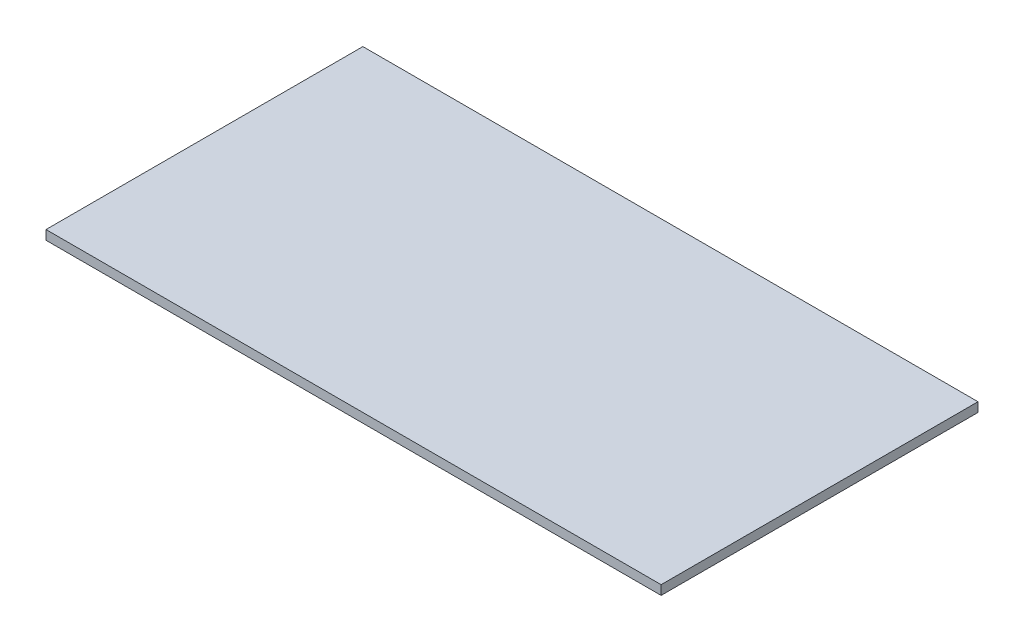
ISO-10303-21;
HEADER;
FILE_DESCRIPTION(('STEP AP214'),'2;1');
FILE_NAME('part.step','',(''),(''),'','','');
FILE_SCHEMA(('AUTOMOTIVE_DESIGN { 1 0 10303 214 1 1 1 1 }'));
ENDSEC;
DATA;
#1=APPLICATION_CONTEXT('core data for automotive mechanical design processes');
#2=APPLICATION_PROTOCOL_DEFINITION('international standard','automotive_design',2000,#1);
#3=PRODUCT_CONTEXT('',#1,'mechanical');
#4=PRODUCT('Part','Part','',(#3));
#5=PRODUCT_RELATED_PRODUCT_CATEGORY('part','',(#4));
#6=PRODUCT_DEFINITION_FORMATION('','',#4);
#7=PRODUCT_DEFINITION_CONTEXT('part definition',#1,'design');
#8=PRODUCT_DEFINITION('design','',#6,#7);
#9=PRODUCT_DEFINITION_SHAPE('','',#8);
#10=(LENGTH_UNIT() NAMED_UNIT(*) SI_UNIT(.MILLI.,.METRE.));
#11=(NAMED_UNIT(*) PLANE_ANGLE_UNIT() SI_UNIT($,.RADIAN.));
#12=(NAMED_UNIT(*) SI_UNIT($,.STERADIAN.) SOLID_ANGLE_UNIT());
#13=UNCERTAINTY_MEASURE_WITH_UNIT(LENGTH_MEASURE(1.E-05),#10,'distance_accuracy_value','');
#14=(GEOMETRIC_REPRESENTATION_CONTEXT(3) GLOBAL_UNCERTAINTY_ASSIGNED_CONTEXT((#13)) GLOBAL_UNIT_ASSIGNED_CONTEXT((#10,
#11,#12)) REPRESENTATION_CONTEXT('',''));
#15=CARTESIAN_POINT('',(0.,0.,0.));
#16=DIRECTION('',(0.,0.,1.));
#17=DIRECTION('',(1.,0.,0.));
#18=AXIS2_PLACEMENT_3D('',#15,#16,#17);
#19=CARTESIAN_POINT('',(0.,3.,0.));
#20=DIRECTION('',(1.,0.,0.));
#21=DIRECTION('',(0.,0.,-1.));
#22=AXIS2_PLACEMENT_3D('',#19,#20,#21);
#23=PLANE('',#22);
#24=DIRECTION('',(0.,0.,1.));
#25=VECTOR('',#24,1.);
#26=CARTESIAN_POINT('',(0.,0.,0.));
#27=LINE('',#26,#25);
#28=CARTESIAN_POINT('',(0.,0.,-102.));
#29=VERTEX_POINT('',#28);
#30=CARTESIAN_POINT('',(0.,0.,0.));
#31=VERTEX_POINT('',#30);
#32=EDGE_CURVE('E96',#29,#31,#27,.T.);
#33=ORIENTED_EDGE('',*,*,#32,.T.);
#34=DIRECTION('',(0.,-1.,0.));
#35=VECTOR('',#34,1.);
#36=CARTESIAN_POINT('',(0.,3.,0.));
#37=LINE('',#36,#35);
#38=CARTESIAN_POINT('',(0.,3.,0.));
#39=VERTEX_POINT('',#38);
#40=EDGE_CURVE('E11',#39,#31,#37,.T.);
#41=ORIENTED_EDGE('',*,*,#40,.F.);
#42=DIRECTION('',(0.,0.,1.));
#43=VECTOR('',#42,1.);
#44=CARTESIAN_POINT('',(0.,3.,0.));
#45=LINE('',#44,#43);
#46=CARTESIAN_POINT('',(0.,3.,-102.));
#47=VERTEX_POINT('',#46);
#48=EDGE_CURVE('E84',#47,#39,#45,.T.);
#49=ORIENTED_EDGE('',*,*,#48,.F.);
#50=DIRECTION('',(0.,-1.,0.));
#51=VECTOR('',#50,1.);
#52=CARTESIAN_POINT('',(0.,3.,-102.));
#53=LINE('',#52,#51);
#54=EDGE_CURVE('E92',#47,#29,#53,.T.);
#55=ORIENTED_EDGE('',*,*,#54,.T.);
#56=EDGE_LOOP('',(#33,#41,#49,#55));
#57=FACE_BOUND('',#56,.T.);
#58=ADVANCED_FACE('F33',(#57),#23,.F.);
#59=CARTESIAN_POINT('',(0.,3.,0.));
#60=DIRECTION('',(0.,0.,-1.));
#61=DIRECTION('',(-1.,0.,0.));
#62=AXIS2_PLACEMENT_3D('',#59,#60,#61);
#63=PLANE('',#62);
#64=DIRECTION('',(1.,0.,0.));
#65=VECTOR('',#64,1.);
#66=CARTESIAN_POINT('',(0.,0.,0.));
#67=LINE('',#66,#65);
#68=CARTESIAN_POINT('',(198.,0.,0.));
#69=VERTEX_POINT('',#68);
#70=EDGE_CURVE('E88',#31,#69,#67,.T.);
#71=ORIENTED_EDGE('',*,*,#70,.T.);
#72=DIRECTION('',(0.,-1.,0.));
#73=VECTOR('',#72,1.);
#74=CARTESIAN_POINT('',(198.,3.,0.));
#75=LINE('',#74,#73);
#76=CARTESIAN_POINT('',(198.,3.,0.));
#77=VERTEX_POINT('',#76);
#78=EDGE_CURVE('E41',#77,#69,#75,.T.);
#79=ORIENTED_EDGE('',*,*,#78,.F.);
#80=DIRECTION('',(1.,0.,0.));
#81=VECTOR('',#80,1.);
#82=CARTESIAN_POINT('',(0.,3.,0.));
#83=LINE('',#82,#81);
#84=EDGE_CURVE('E79',#39,#77,#83,.T.);
#85=ORIENTED_EDGE('',*,*,#84,.F.);
#86=ORIENTED_EDGE('',*,*,#40,.T.);
#87=EDGE_LOOP('',(#71,#79,#85,#86));
#88=FACE_BOUND('',#87,.T.);
#89=ADVANCED_FACE('F87',(#88),#63,.F.);
#90=CARTESIAN_POINT('',(198.,3.,0.));
#91=DIRECTION('',(-1.,0.,0.));
#92=DIRECTION('',(0.,0.,1.));
#93=AXIS2_PLACEMENT_3D('',#90,#91,#92);
#94=PLANE('',#93);
#95=DIRECTION('',(0.,0.,-1.));
#96=VECTOR('',#95,1.);
#97=CARTESIAN_POINT('',(198.,0.,0.));
#98=LINE('',#97,#96);
#99=CARTESIAN_POINT('',(198.,0.,-102.));
#100=VERTEX_POINT('',#99);
#101=EDGE_CURVE('E66',#69,#100,#98,.T.);
#102=ORIENTED_EDGE('',*,*,#101,.T.);
#103=DIRECTION('',(0.,-1.,0.));
#104=VECTOR('',#103,1.);
#105=CARTESIAN_POINT('',(198.,3.,-102.));
#106=LINE('',#105,#104);
#107=CARTESIAN_POINT('',(198.,3.,-102.));
#108=VERTEX_POINT('',#107);
#109=EDGE_CURVE('E89',#108,#100,#106,.T.);
#110=ORIENTED_EDGE('',*,*,#109,.F.);
#111=DIRECTION('',(0.,0.,-1.));
#112=VECTOR('',#111,1.);
#113=CARTESIAN_POINT('',(198.,3.,0.));
#114=LINE('',#113,#112);
#115=EDGE_CURVE('E82',#77,#108,#114,.T.);
#116=ORIENTED_EDGE('',*,*,#115,.F.);
#117=ORIENTED_EDGE('',*,*,#78,.T.);
#118=EDGE_LOOP('',(#102,#110,#116,#117));
#119=FACE_BOUND('',#118,.T.);
#120=ADVANCED_FACE('F90',(#119),#94,.F.);
#121=CARTESIAN_POINT('',(0.,3.,-102.));
#122=DIRECTION('',(0.,0.,1.));
#123=DIRECTION('',(1.,0.,0.));
#124=AXIS2_PLACEMENT_3D('',#121,#122,#123);
#125=PLANE('',#124);
#126=DIRECTION('',(-1.,0.,0.));
#127=VECTOR('',#126,1.);
#128=CARTESIAN_POINT('',(0.,0.,-102.));
#129=LINE('',#128,#127);
#130=EDGE_CURVE('E72',#100,#29,#129,.T.);
#131=ORIENTED_EDGE('',*,*,#130,.T.);
#132=ORIENTED_EDGE('',*,*,#54,.F.);
#133=DIRECTION('',(-1.,0.,0.));
#134=VECTOR('',#133,1.);
#135=CARTESIAN_POINT('',(0.,3.,-102.));
#136=LINE('',#135,#134);
#137=EDGE_CURVE('E49',#108,#47,#136,.T.);
#138=ORIENTED_EDGE('',*,*,#137,.F.);
#139=ORIENTED_EDGE('',*,*,#109,.T.);
#140=EDGE_LOOP('',(#131,#132,#138,#139));
#141=FACE_BOUND('',#140,.T.);
#142=ADVANCED_FACE('F103',(#141),#125,.F.);
#143=CARTESIAN_POINT('',(0.,3.,0.));
#144=DIRECTION('',(0.,-1.,0.));
#145=DIRECTION('',(0.,0.,-1.));
#146=AXIS2_PLACEMENT_3D('',#143,#144,#145);
#147=PLANE('',#146);
#148=ORIENTED_EDGE('',*,*,#48,.T.);
#149=ORIENTED_EDGE('',*,*,#84,.T.);
#150=ORIENTED_EDGE('',*,*,#115,.T.);
#151=ORIENTED_EDGE('',*,*,#137,.T.);
#152=EDGE_LOOP('',(#148,#149,#150,#151));
#153=FACE_BOUND('',#152,.T.);
#154=ADVANCED_FACE('F80',(#153),#147,.F.);
#155=CARTESIAN_POINT('',(0.,0.,0.));
#156=DIRECTION('',(0.,-1.,0.));
#157=DIRECTION('',(0.,0.,-1.));
#158=AXIS2_PLACEMENT_3D('',#155,#156,#157);
#159=PLANE('',#158);
#160=ORIENTED_EDGE('',*,*,#32,.F.);
#161=ORIENTED_EDGE('',*,*,#130,.F.);
#162=ORIENTED_EDGE('',*,*,#101,.F.);
#163=ORIENTED_EDGE('',*,*,#70,.F.);
#164=EDGE_LOOP('',(#160,#161,#162,#163));
#165=FACE_BOUND('',#164,.T.);
#166=ADVANCED_FACE('F106',(#165),#159,.T.);
#167=CLOSED_SHELL('',(#58,#89,#120,#142,#154,#166));
#168=MANIFOLD_SOLID_BREP('B2',#167);
#169=ADVANCED_BREP_SHAPE_REPRESENTATION('',(#18,#168),#14);
#170=SHAPE_DEFINITION_REPRESENTATION(#9,#169);
ENDSEC;
END-ISO-10303-21;
